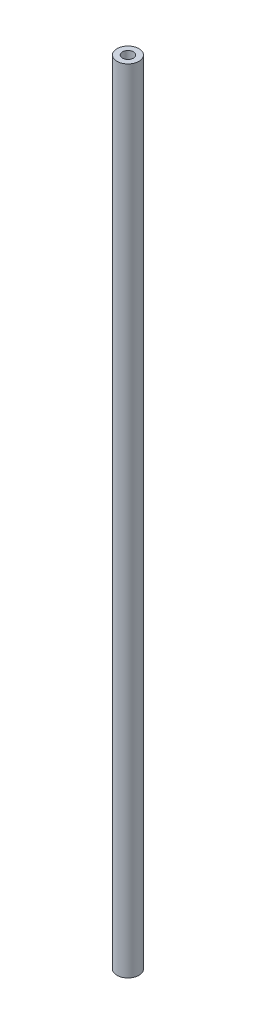
ISO-10303-21;
HEADER;
FILE_DESCRIPTION(('STEP AP214'),'2;1');
FILE_NAME('part.step','',(''),(''),'','','');
FILE_SCHEMA(('AUTOMOTIVE_DESIGN { 1 0 10303 214 1 1 1 1 }'));
ENDSEC;
DATA;
#1=APPLICATION_CONTEXT('core data for automotive mechanical design processes');
#2=APPLICATION_PROTOCOL_DEFINITION('international standard','automotive_design',2000,#1);
#3=PRODUCT_CONTEXT('',#1,'mechanical');
#4=PRODUCT('Part','Part','',(#3));
#5=PRODUCT_RELATED_PRODUCT_CATEGORY('part','',(#4));
#6=PRODUCT_DEFINITION_FORMATION('','',#4);
#7=PRODUCT_DEFINITION_CONTEXT('part definition',#1,'design');
#8=PRODUCT_DEFINITION('design','',#6,#7);
#9=PRODUCT_DEFINITION_SHAPE('','',#8);
#10=(LENGTH_UNIT() NAMED_UNIT(*) SI_UNIT(.MILLI.,.METRE.));
#11=(NAMED_UNIT(*) PLANE_ANGLE_UNIT() SI_UNIT($,.RADIAN.));
#12=(NAMED_UNIT(*) SI_UNIT($,.STERADIAN.) SOLID_ANGLE_UNIT());
#13=UNCERTAINTY_MEASURE_WITH_UNIT(LENGTH_MEASURE(1.E-05),#10,'distance_accuracy_value','');
#14=(GEOMETRIC_REPRESENTATION_CONTEXT(3) GLOBAL_UNCERTAINTY_ASSIGNED_CONTEXT((#13)) GLOBAL_UNIT_ASSIGNED_CONTEXT((#10,
#11,#12)) REPRESENTATION_CONTEXT('',''));
#15=CARTESIAN_POINT('',(0.,0.,0.));
#16=DIRECTION('',(0.,0.,1.));
#17=DIRECTION('',(1.,0.,0.));
#18=AXIS2_PLACEMENT_3D('',#15,#16,#17);
#19=CARTESIAN_POINT('',(0.,914.4,0.));
#20=DIRECTION('',(0.,1.,0.));
#21=DIRECTION('',(0.,0.,1.));
#22=AXIS2_PLACEMENT_3D('',#19,#20,#21);
#23=PLANE('',#22);
#24=CARTESIAN_POINT('',(0.,914.4,0.));
#25=DIRECTION('',(0.,1.,0.));
#26=DIRECTION('',(0.,0.,1.));
#27=AXIS2_PLACEMENT_3D('',#24,#25,#26);
#28=CIRCLE('',#27,12.7);
#29=CARTESIAN_POINT('',(0.,914.4,12.7));
#30=VERTEX_POINT('',#29);
#31=EDGE_CURVE('E10',#30,#30,#28,.T.);
#32=ORIENTED_EDGE('',*,*,#31,.T.);
#33=EDGE_LOOP('',(#32));
#34=FACE_BOUND('',#33,.T.);
#35=CARTESIAN_POINT('',(0.,914.4,0.));
#36=DIRECTION('',(0.,1.,0.));
#37=DIRECTION('',(0.,0.,1.));
#38=AXIS2_PLACEMENT_3D('',#35,#36,#37);
#39=CIRCLE('',#38,6.35);
#40=CARTESIAN_POINT('',(0.,914.4,6.35));
#41=VERTEX_POINT('',#40);
#42=EDGE_CURVE('E42',#41,#41,#39,.T.);
#43=ORIENTED_EDGE('',*,*,#42,.F.);
#44=EDGE_LOOP('',(#43));
#45=FACE_BOUND('',#44,.T.);
#46=ADVANCED_FACE('F31',(#34,#45),#23,.T.);
#47=CARTESIAN_POINT('',(0.,0.,0.));
#48=DIRECTION('',(0.,1.,0.));
#49=DIRECTION('',(0.,0.,1.));
#50=AXIS2_PLACEMENT_3D('',#47,#48,#49);
#51=PLANE('',#50);
#52=CARTESIAN_POINT('',(0.,0.,0.));
#53=DIRECTION('',(0.,1.,0.));
#54=DIRECTION('',(0.,0.,1.));
#55=AXIS2_PLACEMENT_3D('',#52,#53,#54);
#56=CIRCLE('',#55,12.7);
#57=CARTESIAN_POINT('',(0.,0.,12.7));
#58=VERTEX_POINT('',#57);
#59=EDGE_CURVE('E35',#58,#58,#56,.T.);
#60=ORIENTED_EDGE('',*,*,#59,.F.);
#61=EDGE_LOOP('',(#60));
#62=FACE_BOUND('',#61,.T.);
#63=CARTESIAN_POINT('',(0.,0.,0.));
#64=DIRECTION('',(0.,1.,0.));
#65=DIRECTION('',(0.,0.,1.));
#66=AXIS2_PLACEMENT_3D('',#63,#64,#65);
#67=CIRCLE('',#66,6.35);
#68=CARTESIAN_POINT('',(0.,0.,6.35));
#69=VERTEX_POINT('',#68);
#70=EDGE_CURVE('E44',#69,#69,#67,.T.);
#71=ORIENTED_EDGE('',*,*,#70,.T.);
#72=EDGE_LOOP('',(#71));
#73=FACE_BOUND('',#72,.T.);
#74=ADVANCED_FACE('F54',(#62,#73),#51,.F.);
#75=CARTESIAN_POINT('',(0.,914.4,0.));
#76=DIRECTION('',(0.,-1.,0.));
#77=DIRECTION('',(0.,0.,-1.));
#78=AXIS2_PLACEMENT_3D('',#75,#76,#77);
#79=CYLINDRICAL_SURFACE('',#78,12.7);
#80=ORIENTED_EDGE('',*,*,#31,.F.);
#81=EDGE_LOOP('',(#80));
#82=FACE_BOUND('',#81,.T.);
#83=ORIENTED_EDGE('',*,*,#59,.T.);
#84=EDGE_LOOP('',(#83));
#85=FACE_BOUND('',#84,.T.);
#86=ADVANCED_FACE('F33',(#82,#85),#79,.T.);
#87=CARTESIAN_POINT('',(0.,914.4,0.));
#88=DIRECTION('',(0.,-1.,0.));
#89=DIRECTION('',(0.,0.,-1.));
#90=AXIS2_PLACEMENT_3D('',#87,#88,#89);
#91=CYLINDRICAL_SURFACE('',#90,6.35);
#92=ORIENTED_EDGE('',*,*,#42,.T.);
#93=EDGE_LOOP('',(#92));
#94=FACE_BOUND('',#93,.T.);
#95=ORIENTED_EDGE('',*,*,#70,.F.);
#96=EDGE_LOOP('',(#95));
#97=FACE_BOUND('',#96,.T.);
#98=ADVANCED_FACE('F50',(#94,#97),#91,.F.);
#99=CLOSED_SHELL('',(#46,#74,#86,#98));
#100=MANIFOLD_SOLID_BREP('B2',#99);
#101=ADVANCED_BREP_SHAPE_REPRESENTATION('',(#18,#100),#14);
#102=SHAPE_DEFINITION_REPRESENTATION(#9,#101);
ENDSEC;
END-ISO-10303-21;
